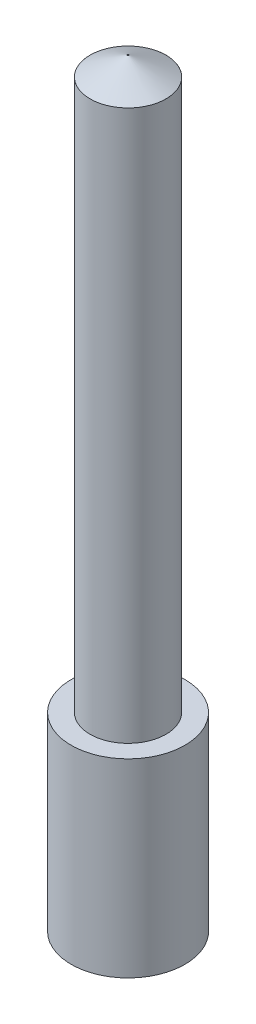
ISO-10303-21;
HEADER;
FILE_DESCRIPTION(('STEP AP214'),'2;1');
FILE_NAME('part.step','',(''),(''),'','','');
FILE_SCHEMA(('AUTOMOTIVE_DESIGN { 1 0 10303 214 1 1 1 1 }'));
ENDSEC;
DATA;
#1=APPLICATION_CONTEXT('core data for automotive mechanical design processes');
#2=APPLICATION_PROTOCOL_DEFINITION('international standard','automotive_design',2000,#1);
#3=PRODUCT_CONTEXT('',#1,'mechanical');
#4=PRODUCT('Part','Part','',(#3));
#5=PRODUCT_RELATED_PRODUCT_CATEGORY('part','',(#4));
#6=PRODUCT_DEFINITION_FORMATION('','',#4);
#7=PRODUCT_DEFINITION_CONTEXT('part definition',#1,'design');
#8=PRODUCT_DEFINITION('design','',#6,#7);
#9=PRODUCT_DEFINITION_SHAPE('','',#8);
#10=(LENGTH_UNIT() NAMED_UNIT(*) SI_UNIT(.MILLI.,.METRE.));
#11=(NAMED_UNIT(*) PLANE_ANGLE_UNIT() SI_UNIT($,.RADIAN.));
#12=(NAMED_UNIT(*) SI_UNIT($,.STERADIAN.) SOLID_ANGLE_UNIT());
#13=UNCERTAINTY_MEASURE_WITH_UNIT(LENGTH_MEASURE(1.E-05),#10,'distance_accuracy_value','');
#14=(GEOMETRIC_REPRESENTATION_CONTEXT(3) GLOBAL_UNCERTAINTY_ASSIGNED_CONTEXT((#13)) GLOBAL_UNIT_ASSIGNED_CONTEXT((#10,
#11,#12)) REPRESENTATION_CONTEXT('',''));
#15=CARTESIAN_POINT('',(0.,0.,0.));
#16=DIRECTION('',(0.,0.,1.));
#17=DIRECTION('',(1.,0.,0.));
#18=AXIS2_PLACEMENT_3D('',#15,#16,#17);
#19=CARTESIAN_POINT('',(0.,195.,0.));
#20=DIRECTION('',(0.,-1.,0.));
#21=DIRECTION('',(0.,0.,1.));
#22=AXIS2_PLACEMENT_3D('',#19,#20,#21);
#23=CONICAL_SURFACE('',#22,10.,1.09955742875643);
#24=CARTESIAN_POINT('',(0.,200.,0.));
#25=DIRECTION('',(0.,1.,0.));
#26=DIRECTION('',(0.,0.,1.));
#27=AXIS2_PLACEMENT_3D('',#24,#25,#26);
#28=CIRCLE('',#27,0.186947472474213);
#29=CARTESIAN_POINT('',(0.,200.,0.18694747247424));
#30=VERTEX_POINT('',#29);
#31=EDGE_CURVE('E11',#30,#30,#28,.T.);
#32=CARTESIAN_POINT('',(0.,195.,0.));
#33=DIRECTION('',(0.,1.,0.));
#34=DIRECTION('',(0.,0.,1.));
#35=AXIS2_PLACEMENT_3D('',#32,#33,#34);
#36=CIRCLE('',#35,10.);
#37=CARTESIAN_POINT('',(0.,195.,10.));
#38=VERTEX_POINT('',#37);
#39=EDGE_CURVE('E51',#38,#38,#36,.T.);
#40=CARTESIAN_POINT('',(0.,200.,0.18694747247424));
#41=CARTESIAN_POINT('',(0.,199.947916666667,0.289166769635964));
#42=CARTESIAN_POINT('',(0.,199.895833333333,0.391386066797691));
#43=CARTESIAN_POINT('',(0.,199.791666666667,0.595824661121147));
#44=CARTESIAN_POINT('',(0.,199.739583333333,0.698043958282875));
#45=CARTESIAN_POINT('',(0.,199.635416666667,0.902482552606329));
#46=CARTESIAN_POINT('',(0.,199.583333333333,1.00470184976806));
#47=CARTESIAN_POINT('',(0.,199.479166666667,1.20914044409151));
#48=CARTESIAN_POINT('',(0.,199.427083333333,1.31135974125324));
#49=CARTESIAN_POINT('',(0.,199.322916666667,1.51579833557669));
#50=CARTESIAN_POINT('',(0.,199.270833333333,1.61801763273842));
#51=CARTESIAN_POINT('',(0.,199.166666666667,1.82245622706187));
#52=CARTESIAN_POINT('',(0.,199.114583333333,1.9246755242236));
#53=CARTESIAN_POINT('',(0.,199.010416666667,2.12911411854705));
#54=CARTESIAN_POINT('',(0.,198.958333333333,2.23133341570878));
#55=CARTESIAN_POINT('',(0.,198.854166666667,2.43577201003223));
#56=CARTESIAN_POINT('',(0.,198.802083333333,2.53799130719396));
#57=CARTESIAN_POINT('',(0.,198.697916666667,2.74242990151741));
#58=CARTESIAN_POINT('',(0.,198.645833333333,2.84464919867914));
#59=CARTESIAN_POINT('',(0.,198.541666666667,3.0490877930026));
#60=CARTESIAN_POINT('',(0.,198.489583333333,3.15130709016432));
#61=CARTESIAN_POINT('',(0.,198.385416666667,3.35574568448778));
#62=CARTESIAN_POINT('',(0.,198.333333333333,3.4579649816495));
#63=CARTESIAN_POINT('',(0.,198.229166666667,3.66240357597296));
#64=CARTESIAN_POINT('',(0.,198.177083333333,3.76462287313468));
#65=CARTESIAN_POINT('',(0.,198.072916666667,3.96906146745814));
#66=CARTESIAN_POINT('',(0.,198.020833333333,4.07128076461986));
#67=CARTESIAN_POINT('',(0.,197.916666666667,4.27571935894332));
#68=CARTESIAN_POINT('',(0.,197.864583333333,4.37793865610505));
#69=CARTESIAN_POINT('',(0.,197.760416666667,4.5823772504285));
#70=CARTESIAN_POINT('',(0.,197.708333333333,4.68459654759023));
#71=CARTESIAN_POINT('',(0.,197.604166666667,4.88903514191368));
#72=CARTESIAN_POINT('',(0.,197.552083333333,4.99125443907541));
#73=CARTESIAN_POINT('',(0.,197.447916666667,5.19569303339886));
#74=CARTESIAN_POINT('',(0.,197.395833333333,5.29791233056059));
#75=CARTESIAN_POINT('',(0.,197.291666666667,5.50235092488404));
#76=CARTESIAN_POINT('',(0.,197.239583333333,5.60457022204577));
#77=CARTESIAN_POINT('',(0.,197.135416666667,5.80900881636922));
#78=CARTESIAN_POINT('',(0.,197.083333333333,5.91122811353095));
#79=CARTESIAN_POINT('',(0.,196.979166666667,6.1156667078544));
#80=CARTESIAN_POINT('',(0.,196.927083333333,6.21788600501613));
#81=CARTESIAN_POINT('',(0.,196.822916666667,6.42232459933958));
#82=CARTESIAN_POINT('',(0.,196.770833333333,6.52454389650131));
#83=CARTESIAN_POINT('',(0.,196.666666666667,6.72898249082476));
#84=CARTESIAN_POINT('',(0.,196.614583333333,6.83120178798649));
#85=CARTESIAN_POINT('',(0.,196.510416666667,7.03564038230995));
#86=CARTESIAN_POINT('',(0.,196.458333333333,7.13785967947168));
#87=CARTESIAN_POINT('',(0.,196.354166666667,7.34229827379513));
#88=CARTESIAN_POINT('',(0.,196.302083333333,7.44451757095685));
#89=CARTESIAN_POINT('',(0.,196.197916666667,7.64895616528031));
#90=CARTESIAN_POINT('',(0.,196.145833333333,7.75117546244203));
#91=CARTESIAN_POINT('',(0.,196.041666666667,7.95561405676549));
#92=CARTESIAN_POINT('',(0.,195.989583333333,8.05783335392722));
#93=CARTESIAN_POINT('',(0.,195.885416666667,8.26227194825067));
#94=CARTESIAN_POINT('',(0.,195.833333333333,8.3644912454124));
#95=CARTESIAN_POINT('',(0.,195.729166666667,8.56892983973585));
#96=CARTESIAN_POINT('',(0.,195.677083333333,8.67114913689758));
#97=CARTESIAN_POINT('',(0.,195.572916666667,8.87558773122103));
#98=CARTESIAN_POINT('',(0.,195.520833333333,8.97780702838276));
#99=CARTESIAN_POINT('',(0.,195.416666666667,9.18224562270621));
#100=CARTESIAN_POINT('',(0.,195.364583333333,9.28446491986794));
#101=CARTESIAN_POINT('',(0.,195.260416666667,9.48890351419139));
#102=CARTESIAN_POINT('',(0.,195.208333333333,9.59112281135312));
#103=CARTESIAN_POINT('',(0.,195.104166666667,9.79556140567657));
#104=CARTESIAN_POINT('',(0.,195.052083333333,9.8977807028383));
#105=CARTESIAN_POINT('',(0.,195.,10.));
#106=B_SPLINE_CURVE_WITH_KNOTS('',3,(#40,#41,#42,#43,#44,#45,#46,#47,#48,#49,#50,#51,#52,#53,
#54,#55,#56,#57,#58,#59,#60,#61,#62,#63,#64,#65,#66,#67,#68,#69,#70,#71,#72,#73,#74,#75,#76,#77,
#78,#79,#80,#81,#82,#83,#84,#85,#86,#87,#88,#89,#90,#91,#92,#93,#94,#95,#96,#97,#98,#99,#100,
#101,#102,#103,#104,#105),.UNSPECIFIED.,.F.,.F.,(4,2,2,2,2,2,2,2,2,2,2,2,2,2,2,2,2,2,2,2,2,2,2,
2,2,2,2,2,2,2,2,2,4),(0.,0.34417019759146,0.688340395182907,1.03251059277435,1.3766807903658,
1.72085098795725,2.0650211855487,2.40919138314014,2.7533615807316,3.09753177832305,
3.4417019759145,3.78587217350595,4.13004237109739,4.47421256868884,4.81838276628029,
5.16255296387174,5.50672316146318,5.85089335905464,6.19506355664609,6.53923375423754,
6.88340395182898,7.22757414942043,7.57174434701188,7.91591454460333,8.26008474219479,
8.60425493978623,8.94842513737768,9.29259533496913,9.63676553256058,9.98093573015202,
10.3251059277435,10.6692761253349,11.0134463229264),.UNSPECIFIED.);
#107=EDGE_CURVE('BSEAM44',#30,#38,#106,.T.);
#108=ORIENTED_EDGE('',*,*,#31,.F.);
#109=ORIENTED_EDGE('',*,*,#39,.T.);
#110=ORIENTED_EDGE('',*,*,#107,.T.);
#111=ORIENTED_EDGE('',*,*,#107,.F.);
#112=EDGE_LOOP('',(#108,#110,#109,#111));
#113=FACE_BOUND('',#112,.T.);
#114=ADVANCED_FACE('F44',(#113),#23,.T.);
#115=CARTESIAN_POINT('',(0.,200.,0.));
#116=DIRECTION('',(0.,1.,0.));
#117=DIRECTION('',(0.,0.,1.));
#118=AXIS2_PLACEMENT_3D('',#115,#116,#117);
#119=PLANE('',#118);
#120=ORIENTED_EDGE('',*,*,#31,.T.);
#121=EDGE_LOOP('',(#120));
#122=FACE_BOUND('',#121,.T.);
#123=ADVANCED_FACE('F61',(#122),#119,.T.);
#124=CARTESIAN_POINT('',(0.,195.,0.));
#125=DIRECTION('',(0.,1.,0.));
#126=DIRECTION('',(0.,0.,1.));
#127=AXIS2_PLACEMENT_3D('',#124,#125,#126);
#128=PLANE('',#127);
#129=ORIENTED_EDGE('',*,*,#39,.F.);
#130=EDGE_LOOP('',(#129));
#131=FACE_BOUND('',#130,.T.);
#132=ADVANCED_FACE('F59',(#131),#128,.F.);
#133=CLOSED_SHELL('',(#114,#123,#132));
#134=MANIFOLD_SOLID_BREP('B2',#133);
#135=CARTESIAN_POINT('',(0.,195.,0.));
#136=DIRECTION('',(0.,-1.,0.));
#137=DIRECTION('',(0.,0.,-1.));
#138=AXIS2_PLACEMENT_3D('',#135,#136,#137);
#139=CYLINDRICAL_SURFACE('',#138,10.);
#140=CARTESIAN_POINT('',(0.,195.,0.));
#141=DIRECTION('',(0.,1.,0.));
#142=DIRECTION('',(0.,0.,1.));
#143=AXIS2_PLACEMENT_3D('',#140,#141,#142);
#144=CIRCLE('',#143,10.);
#145=CARTESIAN_POINT('',(0.,195.,10.));
#146=VERTEX_POINT('',#145);
#147=EDGE_CURVE('E100',#146,#146,#144,.T.);
#148=ORIENTED_EDGE('',*,*,#147,.F.);
#149=EDGE_LOOP('',(#148));
#150=FACE_BOUND('',#149,.T.);
#151=CARTESIAN_POINT('',(0.,50.,0.));
#152=DIRECTION('',(0.,-1.,0.));
#153=DIRECTION('',(0.,0.,-1.));
#154=AXIS2_PLACEMENT_3D('',#151,#152,#153);
#155=CIRCLE('',#154,10.);
#156=CARTESIAN_POINT('',(0.,50.,-10.));
#157=VERTEX_POINT('',#156);
#158=EDGE_CURVE('E43',#157,#157,#155,.T.);
#159=ORIENTED_EDGE('',*,*,#158,.F.);
#160=EDGE_LOOP('',(#159));
#161=FACE_BOUND('',#160,.T.);
#162=ADVANCED_FACE('F93',(#150,#161),#139,.T.);
#163=CARTESIAN_POINT('',(0.,195.,0.));
#164=DIRECTION('',(0.,1.,0.));
#165=DIRECTION('',(0.,0.,1.));
#166=AXIS2_PLACEMENT_3D('',#163,#164,#165);
#167=PLANE('',#166);
#168=ORIENTED_EDGE('',*,*,#147,.T.);
#169=EDGE_LOOP('',(#168));
#170=FACE_BOUND('',#169,.T.);
#171=ADVANCED_FACE('F122',(#170),#167,.T.);
#172=CARTESIAN_POINT('',(0.,50.,0.));
#173=DIRECTION('',(0.,-1.,0.));
#174=DIRECTION('',(0.,0.,-1.));
#175=AXIS2_PLACEMENT_3D('',#172,#173,#174);
#176=CYLINDRICAL_SURFACE('',#175,15.);
#177=CARTESIAN_POINT('',(0.,50.,0.));
#178=DIRECTION('',(0.,-1.,0.));
#179=DIRECTION('',(0.,0.,-1.));
#180=AXIS2_PLACEMENT_3D('',#177,#178,#179);
#181=CIRCLE('',#180,15.);
#182=CARTESIAN_POINT('',(0.,50.,-15.));
#183=VERTEX_POINT('',#182);
#184=EDGE_CURVE('E106',#183,#183,#181,.T.);
#185=ORIENTED_EDGE('',*,*,#184,.T.);
#186=EDGE_LOOP('',(#185));
#187=FACE_BOUND('',#186,.T.);
#188=CARTESIAN_POINT('',(0.,0.,0.));
#189=DIRECTION('',(0.,-1.,0.));
#190=DIRECTION('',(0.,0.,-1.));
#191=AXIS2_PLACEMENT_3D('',#188,#189,#190);
#192=CIRCLE('',#191,15.);
#193=CARTESIAN_POINT('',(0.,0.,-15.));
#194=VERTEX_POINT('',#193);
#195=EDGE_CURVE('E111',#194,#194,#192,.T.);
#196=ORIENTED_EDGE('',*,*,#195,.F.);
#197=EDGE_LOOP('',(#196));
#198=FACE_BOUND('',#197,.T.);
#199=ADVANCED_FACE('F119',(#187,#198),#176,.T.);
#200=CARTESIAN_POINT('',(0.,50.,0.));
#201=DIRECTION('',(0.,-1.,0.));
#202=DIRECTION('',(0.,0.,-1.));
#203=AXIS2_PLACEMENT_3D('',#200,#201,#202);
#204=PLANE('',#203);
#205=ORIENTED_EDGE('',*,*,#158,.T.);
#206=EDGE_LOOP('',(#205));
#207=FACE_BOUND('',#206,.T.);
#208=ORIENTED_EDGE('',*,*,#184,.F.);
#209=EDGE_LOOP('',(#208));
#210=FACE_BOUND('',#209,.T.);
#211=ADVANCED_FACE('F121',(#207,#210),#204,.F.);
#212=CARTESIAN_POINT('',(0.,0.,0.));
#213=DIRECTION('',(0.,1.,0.));
#214=DIRECTION('',(0.,0.,1.));
#215=AXIS2_PLACEMENT_3D('',#212,#213,#214);
#216=PLANE('',#215);
#217=ORIENTED_EDGE('',*,*,#195,.T.);
#218=EDGE_LOOP('',(#217));
#219=FACE_BOUND('',#218,.T.);
#220=ADVANCED_FACE('F117',(#219),#216,.F.);
#221=CLOSED_SHELL('',(#162,#171,#199,#211,#220));
#222=MANIFOLD_SOLID_BREP('B6',#221);
#223=ADVANCED_BREP_SHAPE_REPRESENTATION('',(#18,#134,#222),#14);
#224=SHAPE_DEFINITION_REPRESENTATION(#9,#223);
ENDSEC;
END-ISO-10303-21;
